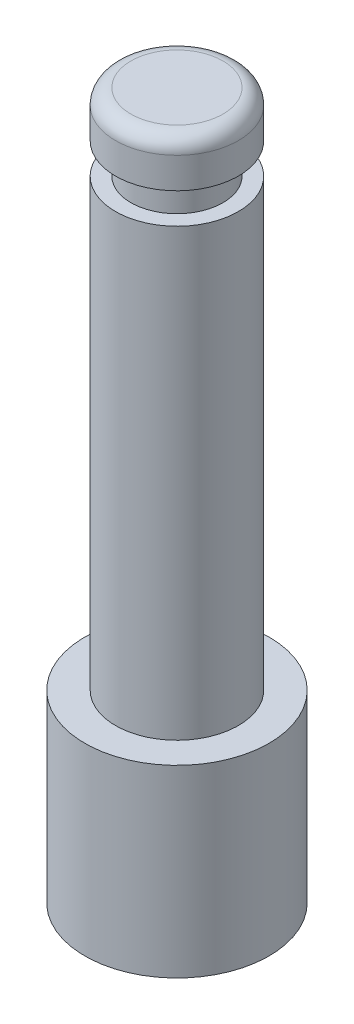
ISO-10303-21;
HEADER;
FILE_DESCRIPTION(('STEP AP214'),'2;1');
FILE_NAME('part.step','',(''),(''),'','','');
FILE_SCHEMA(('AUTOMOTIVE_DESIGN { 1 0 10303 214 1 1 1 1 }'));
ENDSEC;
DATA;
#1=APPLICATION_CONTEXT('core data for automotive mechanical design processes');
#2=APPLICATION_PROTOCOL_DEFINITION('international standard','automotive_design',2000,#1);
#3=PRODUCT_CONTEXT('',#1,'mechanical');
#4=PRODUCT('Part','Part','',(#3));
#5=PRODUCT_RELATED_PRODUCT_CATEGORY('part','',(#4));
#6=PRODUCT_DEFINITION_FORMATION('','',#4);
#7=PRODUCT_DEFINITION_CONTEXT('part definition',#1,'design');
#8=PRODUCT_DEFINITION('design','',#6,#7);
#9=PRODUCT_DEFINITION_SHAPE('','',#8);
#10=(LENGTH_UNIT() NAMED_UNIT(*) SI_UNIT(.MILLI.,.METRE.));
#11=(NAMED_UNIT(*) PLANE_ANGLE_UNIT() SI_UNIT($,.RADIAN.));
#12=(NAMED_UNIT(*) SI_UNIT($,.STERADIAN.) SOLID_ANGLE_UNIT());
#13=UNCERTAINTY_MEASURE_WITH_UNIT(LENGTH_MEASURE(1.E-05),#10,'distance_accuracy_value','');
#14=(GEOMETRIC_REPRESENTATION_CONTEXT(3) GLOBAL_UNCERTAINTY_ASSIGNED_CONTEXT((#13)) GLOBAL_UNIT_ASSIGNED_CONTEXT((#10,
#11,#12)) REPRESENTATION_CONTEXT('',''));
#15=CARTESIAN_POINT('',(0.,0.,0.));
#16=DIRECTION('',(0.,0.,1.));
#17=DIRECTION('',(1.,0.,0.));
#18=AXIS2_PLACEMENT_3D('',#15,#16,#17);
#19=CARTESIAN_POINT('',(0.749999999999987,11.5,0.));
#20=DIRECTION('',(0.,1.,0.));
#21=DIRECTION('',(0.,0.,1.00000000000004));
#22=AXIS2_PLACEMENT_3D('',#19,#20,#21);
#23=PLANE('',#22);
#24=CARTESIAN_POINT('',(0.,11.5000000000001,0.));
#25=DIRECTION('',(0.,-1.,0.));
#26=DIRECTION('',(0.,0.,-1.00000000000004));
#27=AXIS2_PLACEMENT_3D('',#24,#25,#26);
#28=CIRCLE('',#27,0.749999999999999);
#29=CARTESIAN_POINT('',(0.,11.5000000000001,-0.750000000000036));
#30=VERTEX_POINT('',#29);
#31=EDGE_CURVE('E10',#30,#30,#28,.T.);
#32=ORIENTED_EDGE('',*,*,#31,.F.);
#33=EDGE_LOOP('',(#32));
#34=FACE_BOUND('',#33,.T.);
#35=ADVANCED_FACE('F30',(#34),#23,.T.);
#36=CARTESIAN_POINT('',(0.,11.2500000000001,0.));
#37=DIRECTION('',(0.,-1.,0.));
#38=DIRECTION('',(0.,0.,-1.00000000000004));
#39=AXIS2_PLACEMENT_3D('',#36,#37,#38);
#40=TOROIDAL_SURFACE('',#39,0.749999999999999,0.25);
#41=ORIENTED_EDGE('',*,*,#31,.T.);
#42=EDGE_LOOP('',(#41));
#43=FACE_BOUND('',#42,.T.);
#44=CARTESIAN_POINT('',(0.,11.2500000000001,0.));
#45=DIRECTION('',(0.,-1.,0.));
#46=DIRECTION('',(0.,0.,-1.00000000000004));
#47=AXIS2_PLACEMENT_3D('',#44,#45,#46);
#48=CIRCLE('',#47,0.999999999999999);
#49=CARTESIAN_POINT('',(0.,11.2500000000001,-1.00000000000004));
#50=VERTEX_POINT('',#49);
#51=EDGE_CURVE('E36',#50,#50,#48,.T.);
#52=ORIENTED_EDGE('',*,*,#51,.F.);
#53=EDGE_LOOP('',(#52));
#54=FACE_BOUND('',#53,.T.);
#55=ADVANCED_FACE('F81',(#43,#54),#40,.T.);
#56=CARTESIAN_POINT('',(-2.32452945780892E-13,-1.14491749414469E-13,-1.35308431126191E-13));
#57=DIRECTION('',(0.,-1.,0.));
#58=DIRECTION('',(0.,0.,-1.00000000000004));
#59=AXIS2_PLACEMENT_3D('',#56,#57,#58);
#60=CYLINDRICAL_SURFACE('',#59,0.999999999999999);
#61=ORIENTED_EDGE('',*,*,#51,.T.);
#62=EDGE_LOOP('',(#61));
#63=FACE_BOUND('',#62,.T.);
#64=CARTESIAN_POINT('',(0.,10.75,0.));
#65=DIRECTION('',(0.,-1.,0.));
#66=DIRECTION('',(0.,0.,-1.00000000000004));
#67=AXIS2_PLACEMENT_3D('',#64,#65,#66);
#68=CIRCLE('',#67,0.999999999999999);
#69=CARTESIAN_POINT('',(0.,10.75,-1.00000000000008));
#70=VERTEX_POINT('',#69);
#71=EDGE_CURVE('E40',#70,#70,#68,.T.);
#72=ORIENTED_EDGE('',*,*,#71,.F.);
#73=EDGE_LOOP('',(#72));
#74=FACE_BOUND('',#73,.T.);
#75=ADVANCED_FACE('F86',(#63,#74),#60,.T.);
#76=CARTESIAN_POINT('',(0.99999999999999,10.7500000000001,0.));
#77=DIRECTION('',(0.,-1.,0.));
#78=DIRECTION('',(0.,0.,-1.00000000000004));
#79=AXIS2_PLACEMENT_3D('',#76,#77,#78);
#80=PLANE('',#79);
#81=ORIENTED_EDGE('',*,*,#71,.T.);
#82=EDGE_LOOP('',(#81));
#83=FACE_BOUND('',#82,.T.);
#84=CARTESIAN_POINT('',(0.,10.75,0.));
#85=DIRECTION('',(0.,-1.,0.));
#86=DIRECTION('',(0.,0.,-1.00000000000004));
#87=AXIS2_PLACEMENT_3D('',#84,#85,#86);
#88=CIRCLE('',#87,0.749999999999999);
#89=CARTESIAN_POINT('',(0.,10.75,-0.750000000000071));
#90=VERTEX_POINT('',#89);
#91=EDGE_CURVE('E44',#90,#90,#88,.T.);
#92=ORIENTED_EDGE('',*,*,#91,.F.);
#93=EDGE_LOOP('',(#92));
#94=FACE_BOUND('',#93,.T.);
#95=ADVANCED_FACE('F90',(#83,#94),#80,.T.);
#96=CARTESIAN_POINT('',(-2.32452945780892E-13,-1.14491749414469E-13,-1.35308431126191E-13));
#97=DIRECTION('',(0.,-1.,0.));
#98=DIRECTION('',(0.,0.,-1.00000000000004));
#99=AXIS2_PLACEMENT_3D('',#96,#97,#98);
#100=CYLINDRICAL_SURFACE('',#99,0.749999999999999);
#101=ORIENTED_EDGE('',*,*,#91,.T.);
#102=EDGE_LOOP('',(#101));
#103=FACE_BOUND('',#102,.T.);
#104=CARTESIAN_POINT('',(-2.94902990916057E-13,10.25,-1.11022302462516E-13));
#105=DIRECTION('',(0.,-1.,0.));
#106=DIRECTION('',(0.,0.,-1.00000000000004));
#107=AXIS2_PLACEMENT_3D('',#104,#105,#106);
#108=CIRCLE('',#107,0.749999999999999);
#109=CARTESIAN_POINT('',(-2.94944624279481E-13,10.25,-0.750000000000137));
#110=VERTEX_POINT('',#109);
#111=EDGE_CURVE('E49',#110,#110,#108,.T.);
#112=ORIENTED_EDGE('',*,*,#111,.F.);
#113=EDGE_LOOP('',(#112));
#114=FACE_BOUND('',#113,.T.);
#115=ADVANCED_FACE('F96',(#103,#114),#100,.T.);
#116=CARTESIAN_POINT('',(0.749999999999629,10.2500000000001,0.));
#117=DIRECTION('',(0.,1.,0.));
#118=DIRECTION('',(0.,0.,1.00000000000004));
#119=AXIS2_PLACEMENT_3D('',#116,#117,#118);
#120=PLANE('',#119);
#121=ORIENTED_EDGE('',*,*,#111,.T.);
#122=EDGE_LOOP('',(#121));
#123=FACE_BOUND('',#122,.T.);
#124=CARTESIAN_POINT('',(-2.94902990916057E-13,10.25,-1.11022302462516E-13));
#125=DIRECTION('',(0.,-1.,0.));
#126=DIRECTION('',(0.,0.,-1.00000000000004));
#127=AXIS2_PLACEMENT_3D('',#124,#125,#126);
#128=CIRCLE('',#127,0.999999999999999);
#129=CARTESIAN_POINT('',(-2.94958502067288E-13,10.25,-1.00000000000015));
#130=VERTEX_POINT('',#129);
#131=EDGE_CURVE('E52',#130,#130,#128,.T.);
#132=ORIENTED_EDGE('',*,*,#131,.F.);
#133=EDGE_LOOP('',(#132));
#134=FACE_BOUND('',#133,.T.);
#135=ADVANCED_FACE('F100',(#123,#134),#120,.T.);
#136=CARTESIAN_POINT('',(-2.32452945780892E-13,-1.14491749414469E-13,-1.35308431126191E-13));
#137=DIRECTION('',(0.,-1.,0.));
#138=DIRECTION('',(0.,0.,-1.00000000000004));
#139=AXIS2_PLACEMENT_3D('',#136,#137,#138);
#140=CYLINDRICAL_SURFACE('',#139,1.);
#141=ORIENTED_EDGE('',*,*,#131,.T.);
#142=EDGE_LOOP('',(#141));
#143=FACE_BOUND('',#142,.T.);
#144=CARTESIAN_POINT('',(-1.90819582357449E-13,2.99999999999988,-1.00613961606655E-13));
#145=DIRECTION('',(0.,-1.,0.));
#146=DIRECTION('',(0.,0.,-1.00000000000004));
#147=AXIS2_PLACEMENT_3D('',#144,#145,#146);
#148=CIRCLE('',#147,1.);
#149=CARTESIAN_POINT('',(-1.9087509350868E-13,2.99999999999988,-1.00000000000014));
#150=VERTEX_POINT('',#149);
#151=EDGE_CURVE('E55',#150,#150,#148,.T.);
#152=ORIENTED_EDGE('',*,*,#151,.F.);
#153=EDGE_LOOP('',(#152));
#154=FACE_BOUND('',#153,.T.);
#155=ADVANCED_FACE('F77',(#143,#154),#140,.T.);
#156=CARTESIAN_POINT('',(1.50000000000002,2.99999999999989,0.));
#157=DIRECTION('',(0.,1.,0.));
#158=DIRECTION('',(0.,0.,1.00000000000004));
#159=AXIS2_PLACEMENT_3D('',#156,#157,#158);
#160=PLANE('',#159);
#161=ORIENTED_EDGE('',*,*,#151,.T.);
#162=EDGE_LOOP('',(#161));
#163=FACE_BOUND('',#162,.T.);
#164=CARTESIAN_POINT('',(-1.90819582357449E-13,2.99999999999988,-1.00613961606655E-13));
#165=DIRECTION('',(0.,-1.,0.));
#166=DIRECTION('',(0.,0.,-1.00000000000004));
#167=AXIS2_PLACEMENT_3D('',#164,#165,#166);
#168=CIRCLE('',#167,1.5);
#169=CARTESIAN_POINT('',(-1.90902849084296E-13,2.99999999999988,-1.50000000000015));
#170=VERTEX_POINT('',#169);
#171=EDGE_CURVE('E58',#170,#170,#168,.T.);
#172=ORIENTED_EDGE('',*,*,#171,.F.);
#173=EDGE_LOOP('',(#172));
#174=FACE_BOUND('',#173,.T.);
#175=ADVANCED_FACE('F69',(#163,#174),#160,.T.);
#176=CARTESIAN_POINT('',(-2.32452945780892E-13,-1.14491749414469E-13,-1.35308431126191E-13));
#177=DIRECTION('',(0.,-1.,0.));
#178=DIRECTION('',(0.,0.,-1.00000000000004));
#179=AXIS2_PLACEMENT_3D('',#176,#177,#178);
#180=CYLINDRICAL_SURFACE('',#179,1.5);
#181=ORIENTED_EDGE('',*,*,#171,.T.);
#182=EDGE_LOOP('',(#181));
#183=FACE_BOUND('',#182,.T.);
#184=CARTESIAN_POINT('',(-2.32452945780892E-13,-1.14491749414469E-13,-1.35308431126191E-13));
#185=DIRECTION('',(0.,-1.,0.));
#186=DIRECTION('',(0.,0.,-1.00000000000004));
#187=AXIS2_PLACEMENT_3D('',#184,#185,#186);
#188=CIRCLE('',#187,1.5);
#189=CARTESIAN_POINT('',(-2.32536212507739E-13,-1.14491749414469E-13,-1.50000000000019));
#190=VERTEX_POINT('',#189);
#191=EDGE_CURVE('E61',#190,#190,#188,.T.);
#192=ORIENTED_EDGE('',*,*,#191,.F.);
#193=EDGE_LOOP('',(#192));
#194=FACE_BOUND('',#193,.T.);
#195=ADVANCED_FACE('F67',(#183,#194),#180,.T.);
#196=CARTESIAN_POINT('',(-2.32452945780892E-13,-1.14491749414469E-13,-1.35308431126191E-13));
#197=DIRECTION('',(0.,-1.,0.));
#198=DIRECTION('',(0.,0.,-1.00000000000004));
#199=AXIS2_PLACEMENT_3D('',#196,#197,#198);
#200=PLANE('',#199);
#201=ORIENTED_EDGE('',*,*,#191,.T.);
#202=EDGE_LOOP('',(#201));
#203=FACE_BOUND('',#202,.T.);
#204=ADVANCED_FACE('F65',(#203),#200,.T.);
#205=CLOSED_SHELL('',(#35,#55,#75,#95,#115,#135,#155,#175,#195,#204));
#206=MANIFOLD_SOLID_BREP('B2',#205);
#207=ADVANCED_BREP_SHAPE_REPRESENTATION('',(#18,#206),#14);
#208=SHAPE_DEFINITION_REPRESENTATION(#9,#207);
ENDSEC;
END-ISO-10303-21;
